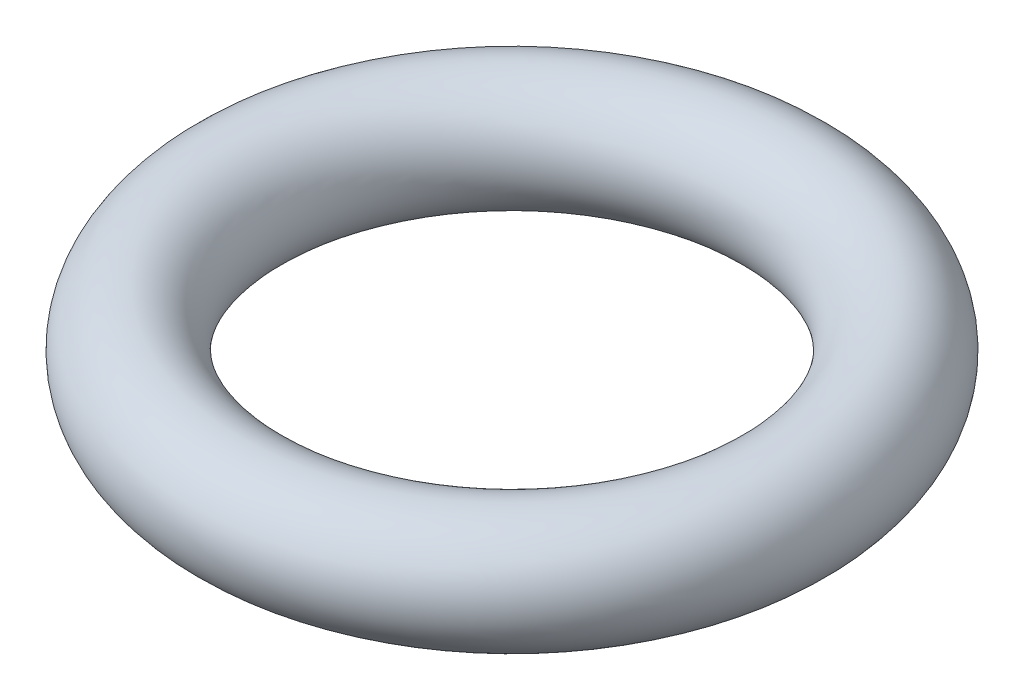
ISO-10303-21;
HEADER;
FILE_DESCRIPTION(('STEP AP214'),'2;1');
FILE_NAME('part.step','',(''),(''),'','','');
FILE_SCHEMA(('AUTOMOTIVE_DESIGN { 1 0 10303 214 1 1 1 1 }'));
ENDSEC;
DATA;
#1=APPLICATION_CONTEXT('core data for automotive mechanical design processes');
#2=APPLICATION_PROTOCOL_DEFINITION('international standard','automotive_design',2000,#1);
#3=PRODUCT_CONTEXT('',#1,'mechanical');
#4=PRODUCT('Part','Part','',(#3));
#5=PRODUCT_RELATED_PRODUCT_CATEGORY('part','',(#4));
#6=PRODUCT_DEFINITION_FORMATION('','',#4);
#7=PRODUCT_DEFINITION_CONTEXT('part definition',#1,'design');
#8=PRODUCT_DEFINITION('design','',#6,#7);
#9=PRODUCT_DEFINITION_SHAPE('','',#8);
#10=(LENGTH_UNIT() NAMED_UNIT(*) SI_UNIT(.MILLI.,.METRE.));
#11=(NAMED_UNIT(*) PLANE_ANGLE_UNIT() SI_UNIT($,.RADIAN.));
#12=(NAMED_UNIT(*) SI_UNIT($,.STERADIAN.) SOLID_ANGLE_UNIT());
#13=UNCERTAINTY_MEASURE_WITH_UNIT(LENGTH_MEASURE(1.E-05),#10,'distance_accuracy_value','');
#14=(GEOMETRIC_REPRESENTATION_CONTEXT(3) GLOBAL_UNCERTAINTY_ASSIGNED_CONTEXT((#13)) GLOBAL_UNIT_ASSIGNED_CONTEXT((#10,
#11,#12)) REPRESENTATION_CONTEXT('',''));
#15=CARTESIAN_POINT('',(0.,0.,0.));
#16=DIRECTION('',(0.,0.,1.));
#17=DIRECTION('',(1.,0.,0.));
#18=AXIS2_PLACEMENT_3D('',#15,#16,#17);
#19=CARTESIAN_POINT('',(0.,0.,0.));
#20=DIRECTION('',(0.,-1.,0.));
#21=DIRECTION('',(0.,0.,-1.));
#22=AXIS2_PLACEMENT_3D('',#19,#20,#21);
#23=TOROIDAL_SURFACE('',#22,70.,15.);
#24=CARTESIAN_POINT('',(0.,0.,-85.));
#25=VERTEX_POINT('',#24);
#26=VERTEX_LOOP('',#25);
#27=FACE_BOUND('',#26,.T.);
#28=ADVANCED_FACE('F38',(#27),#23,.T.);
#29=CLOSED_SHELL('',(#28));
#30=CARTESIAN_POINT('',(0.,0.,0.));
#31=DIRECTION('',(0.,-1.,0.));
#32=DIRECTION('',(0.,0.,-1.));
#33=AXIS2_PLACEMENT_3D('',#30,#31,#32);
#34=TOROIDAL_SURFACE('',#33,70.,10.);
#35=CARTESIAN_POINT('',(0.,0.,-80.));
#36=VERTEX_POINT('',#35);
#37=VERTEX_LOOP('',#36);
#38=FACE_BOUND('',#37,.T.);
#39=ADVANCED_FACE('F50',(#38),#34,.F.);
#40=CLOSED_SHELL('',(#39));
#41=ORIENTED_CLOSED_SHELL('',*,#40,.T.);
#42=BREP_WITH_VOIDS('B2',#29,(#41));
#43=ADVANCED_BREP_SHAPE_REPRESENTATION('',(#18,#42),#14);
#44=SHAPE_DEFINITION_REPRESENTATION(#9,#43);
ENDSEC;
END-ISO-10303-21;
